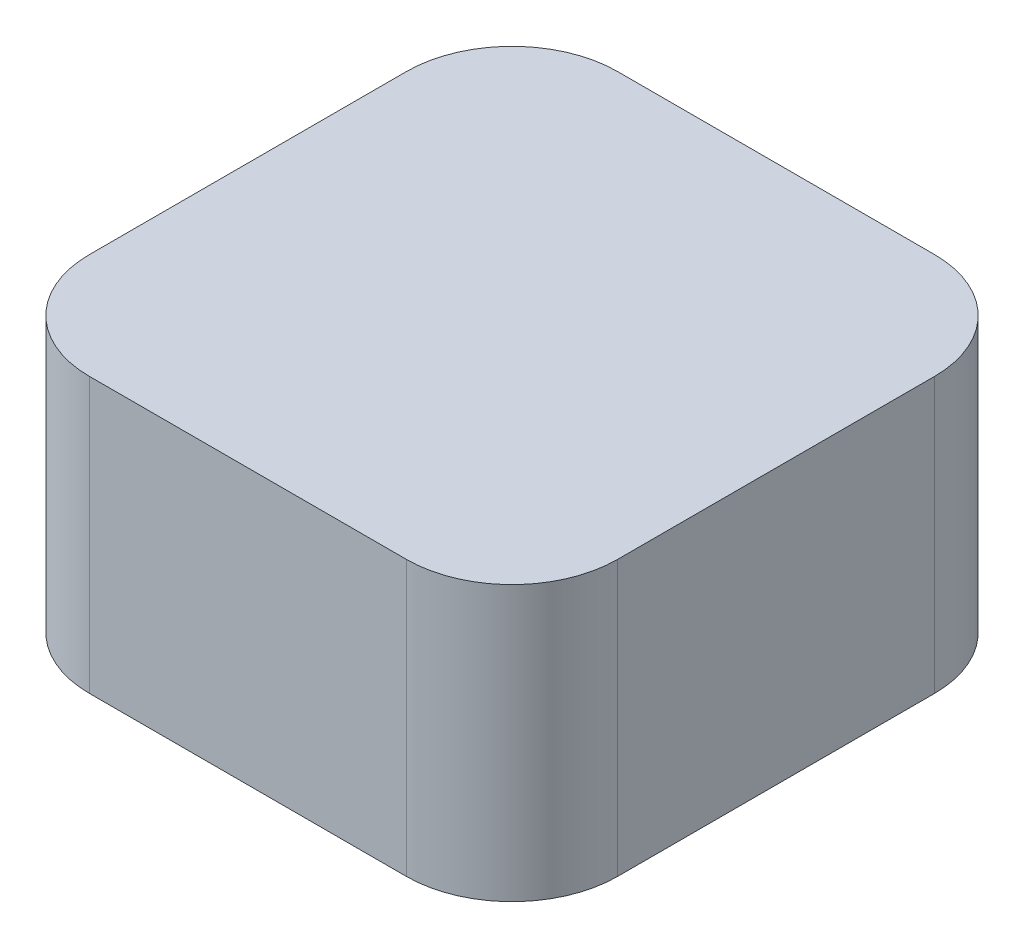
ISO-10303-21;
HEADER;
FILE_DESCRIPTION(('STEP AP214'),'2;1');
FILE_NAME('part.step','',(''),(''),'','','');
FILE_SCHEMA(('AUTOMOTIVE_DESIGN { 1 0 10303 214 1 1 1 1 }'));
ENDSEC;
DATA;
#1=APPLICATION_CONTEXT('core data for automotive mechanical design processes');
#2=APPLICATION_PROTOCOL_DEFINITION('international standard','automotive_design',2000,#1);
#3=PRODUCT_CONTEXT('',#1,'mechanical');
#4=PRODUCT('Part','Part','',(#3));
#5=PRODUCT_RELATED_PRODUCT_CATEGORY('part','',(#4));
#6=PRODUCT_DEFINITION_FORMATION('','',#4);
#7=PRODUCT_DEFINITION_CONTEXT('part definition',#1,'design');
#8=PRODUCT_DEFINITION('design','',#6,#7);
#9=PRODUCT_DEFINITION_SHAPE('','',#8);
#10=(LENGTH_UNIT() NAMED_UNIT(*) SI_UNIT(.MILLI.,.METRE.));
#11=(NAMED_UNIT(*) PLANE_ANGLE_UNIT() SI_UNIT($,.RADIAN.));
#12=(NAMED_UNIT(*) SI_UNIT($,.STERADIAN.) SOLID_ANGLE_UNIT());
#13=UNCERTAINTY_MEASURE_WITH_UNIT(LENGTH_MEASURE(1.E-05),#10,'distance_accuracy_value','');
#14=(GEOMETRIC_REPRESENTATION_CONTEXT(3) GLOBAL_UNCERTAINTY_ASSIGNED_CONTEXT((#13)) GLOBAL_UNIT_ASSIGNED_CONTEXT((#10,
#11,#12)) REPRESENTATION_CONTEXT('',''));
#15=CARTESIAN_POINT('',(0.,0.,0.));
#16=DIRECTION('',(0.,0.,1.));
#17=DIRECTION('',(1.,0.,0.));
#18=AXIS2_PLACEMENT_3D('',#15,#16,#17);
#19=CARTESIAN_POINT('',(0.,6.5,0.));
#20=DIRECTION('',(1.,0.,0.));
#21=DIRECTION('',(0.,0.,-1.));
#22=AXIS2_PLACEMENT_3D('',#19,#20,#21);
#23=PLANE('',#22);
#24=DIRECTION('',(0.,0.,1.));
#25=VECTOR('',#24,1.);
#26=CARTESIAN_POINT('',(0.,6.5,0.));
#27=LINE('',#26,#25);
#28=CARTESIAN_POINT('',(0.,6.5,-10.));
#29=VERTEX_POINT('',#28);
#30=CARTESIAN_POINT('',(0.,6.5,-2.5));
#31=VERTEX_POINT('',#30);
#32=EDGE_CURVE('E125',#29,#31,#27,.T.);
#33=ORIENTED_EDGE('',*,*,#32,.F.);
#34=DIRECTION('',(0.,-1.,0.));
#35=VECTOR('',#34,1.);
#36=CARTESIAN_POINT('',(0.,6.5,-10.));
#37=LINE('',#36,#35);
#38=CARTESIAN_POINT('',(0.,0.,-10.));
#39=VERTEX_POINT('',#38);
#40=EDGE_CURVE('E151',#29,#39,#37,.T.);
#41=ORIENTED_EDGE('',*,*,#40,.T.);
#42=DIRECTION('',(0.,0.,1.));
#43=VECTOR('',#42,1.);
#44=CARTESIAN_POINT('',(0.,0.,0.));
#45=LINE('',#44,#43);
#46=CARTESIAN_POINT('',(0.,0.,-2.5));
#47=VERTEX_POINT('',#46);
#48=EDGE_CURVE('E157',#39,#47,#45,.T.);
#49=ORIENTED_EDGE('',*,*,#48,.T.);
#50=DIRECTION('',(0.,-1.,0.));
#51=VECTOR('',#50,1.);
#52=CARTESIAN_POINT('',(0.,6.5,-2.5));
#53=LINE('',#52,#51);
#54=EDGE_CURVE('E149',#47,#31,#53,.F.);
#55=ORIENTED_EDGE('',*,*,#54,.T.);
#56=EDGE_LOOP('',(#33,#41,#49,#55));
#57=FACE_BOUND('',#56,.T.);
#58=ADVANCED_FACE('F33',(#57),#23,.F.);
#59=CARTESIAN_POINT('',(0.,6.5,0.));
#60=DIRECTION('',(0.,0.,-1.));
#61=DIRECTION('',(-1.,0.,0.));
#62=AXIS2_PLACEMENT_3D('',#59,#60,#61);
#63=PLANE('',#62);
#64=DIRECTION('',(1.,0.,0.));
#65=VECTOR('',#64,1.);
#66=CARTESIAN_POINT('',(0.,6.5,0.));
#67=LINE('',#66,#65);
#68=CARTESIAN_POINT('',(2.5,6.5,0.));
#69=VERTEX_POINT('',#68);
#70=CARTESIAN_POINT('',(9.99999999999999,6.5,0.));
#71=VERTEX_POINT('',#70);
#72=EDGE_CURVE('E128',#69,#71,#67,.T.);
#73=ORIENTED_EDGE('',*,*,#72,.F.);
#74=DIRECTION('',(0.,-1.,0.));
#75=VECTOR('',#74,1.);
#76=CARTESIAN_POINT('',(2.5,6.5,0.));
#77=LINE('',#76,#75);
#78=CARTESIAN_POINT('',(2.5,0.,0.));
#79=VERTEX_POINT('',#78);
#80=EDGE_CURVE('E11',#69,#79,#77,.T.);
#81=ORIENTED_EDGE('',*,*,#80,.T.);
#82=DIRECTION('',(1.,0.,0.));
#83=VECTOR('',#82,1.);
#84=CARTESIAN_POINT('',(0.,0.,0.));
#85=LINE('',#84,#83);
#86=CARTESIAN_POINT('',(9.99999999999999,0.,0.));
#87=VERTEX_POINT('',#86);
#88=EDGE_CURVE('E130',#79,#87,#85,.T.);
#89=ORIENTED_EDGE('',*,*,#88,.T.);
#90=DIRECTION('',(0.,-1.,0.));
#91=VECTOR('',#90,1.);
#92=CARTESIAN_POINT('',(10.,6.5,0.));
#93=LINE('',#92,#91);
#94=EDGE_CURVE('E41',#87,#71,#93,.F.);
#95=ORIENTED_EDGE('',*,*,#94,.T.);
#96=EDGE_LOOP('',(#73,#81,#89,#95));
#97=FACE_BOUND('',#96,.T.);
#98=ADVANCED_FACE('F176',(#97),#63,.F.);
#99=CARTESIAN_POINT('',(12.5,6.5,0.));
#100=DIRECTION('',(-1.,0.,0.));
#101=DIRECTION('',(0.,0.,1.));
#102=AXIS2_PLACEMENT_3D('',#99,#100,#101);
#103=PLANE('',#102);
#104=DIRECTION('',(0.,0.,-1.));
#105=VECTOR('',#104,1.);
#106=CARTESIAN_POINT('',(12.5,0.,0.));
#107=LINE('',#106,#105);
#108=CARTESIAN_POINT('',(12.5,0.,-2.5));
#109=VERTEX_POINT('',#108);
#110=CARTESIAN_POINT('',(12.5,0.,-10.));
#111=VERTEX_POINT('',#110);
#112=EDGE_CURVE('E126',#109,#111,#107,.T.);
#113=ORIENTED_EDGE('',*,*,#112,.T.);
#114=DIRECTION('',(0.,-1.,0.));
#115=VECTOR('',#114,1.);
#116=CARTESIAN_POINT('',(12.5,6.5,-10.));
#117=LINE('',#116,#115);
#118=CARTESIAN_POINT('',(12.5,6.5,-10.));
#119=VERTEX_POINT('',#118);
#120=EDGE_CURVE('E104',#111,#119,#117,.F.);
#121=ORIENTED_EDGE('',*,*,#120,.T.);
#122=DIRECTION('',(0.,0.,-1.));
#123=VECTOR('',#122,1.);
#124=CARTESIAN_POINT('',(12.5,6.5,0.));
#125=LINE('',#124,#123);
#126=CARTESIAN_POINT('',(12.5,6.5,-2.5));
#127=VERTEX_POINT('',#126);
#128=EDGE_CURVE('E165',#127,#119,#125,.T.);
#129=ORIENTED_EDGE('',*,*,#128,.F.);
#130=DIRECTION('',(0.,-1.,0.));
#131=VECTOR('',#130,1.);
#132=CARTESIAN_POINT('',(12.5,6.5,-2.5));
#133=LINE('',#132,#131);
#134=EDGE_CURVE('E109',#127,#109,#133,.T.);
#135=ORIENTED_EDGE('',*,*,#134,.T.);
#136=EDGE_LOOP('',(#113,#121,#129,#135));
#137=FACE_BOUND('',#136,.T.);
#138=ADVANCED_FACE('F175',(#137),#103,.F.);
#139=CARTESIAN_POINT('',(0.,6.5,-12.5));
#140=DIRECTION('',(0.,0.,1.));
#141=DIRECTION('',(1.,0.,0.));
#142=AXIS2_PLACEMENT_3D('',#139,#140,#141);
#143=PLANE('',#142);
#144=DIRECTION('',(-1.,0.,0.));
#145=VECTOR('',#144,1.);
#146=CARTESIAN_POINT('',(0.,6.5,-12.5));
#147=LINE('',#146,#145);
#148=CARTESIAN_POINT('',(9.99999999999999,6.5,-12.5));
#149=VERTEX_POINT('',#148);
#150=CARTESIAN_POINT('',(2.5,6.5,-12.5));
#151=VERTEX_POINT('',#150);
#152=EDGE_CURVE('E119',#149,#151,#147,.T.);
#153=ORIENTED_EDGE('',*,*,#152,.F.);
#154=DIRECTION('',(0.,-1.,0.));
#155=VECTOR('',#154,1.);
#156=CARTESIAN_POINT('',(10.,6.5,-12.5));
#157=LINE('',#156,#155);
#158=CARTESIAN_POINT('',(9.99999999999999,0.,-12.5));
#159=VERTEX_POINT('',#158);
#160=EDGE_CURVE('E103',#149,#159,#157,.T.);
#161=ORIENTED_EDGE('',*,*,#160,.T.);
#162=DIRECTION('',(-1.,0.,0.));
#163=VECTOR('',#162,1.);
#164=CARTESIAN_POINT('',(0.,0.,-12.5));
#165=LINE('',#164,#163);
#166=CARTESIAN_POINT('',(2.5,0.,-12.5));
#167=VERTEX_POINT('',#166);
#168=EDGE_CURVE('E116',#159,#167,#165,.T.);
#169=ORIENTED_EDGE('',*,*,#168,.T.);
#170=DIRECTION('',(0.,-1.,0.));
#171=VECTOR('',#170,1.);
#172=CARTESIAN_POINT('',(2.5,6.5,-12.5));
#173=LINE('',#172,#171);
#174=EDGE_CURVE('E121',#167,#151,#173,.F.);
#175=ORIENTED_EDGE('',*,*,#174,.T.);
#176=EDGE_LOOP('',(#153,#161,#169,#175));
#177=FACE_BOUND('',#176,.T.);
#178=ADVANCED_FACE('F115',(#177),#143,.F.);
#179=CARTESIAN_POINT('',(0.,6.5,0.));
#180=DIRECTION('',(0.,-1.,0.));
#181=DIRECTION('',(0.,0.,-1.));
#182=AXIS2_PLACEMENT_3D('',#179,#180,#181);
#183=PLANE('',#182);
#184=ORIENTED_EDGE('',*,*,#128,.T.);
#185=CARTESIAN_POINT('',(10.,6.5,-10.));
#186=DIRECTION('',(0.,-1.,0.));
#187=DIRECTION('',(0.,0.,-1.));
#188=AXIS2_PLACEMENT_3D('',#185,#186,#187);
#189=CIRCLE('',#188,2.5);
#190=EDGE_CURVE('E147',#119,#149,#189,.F.);
#191=ORIENTED_EDGE('',*,*,#190,.T.);
#192=ORIENTED_EDGE('',*,*,#152,.T.);
#193=CARTESIAN_POINT('',(2.5,6.5,-10.));
#194=DIRECTION('',(0.,-1.,0.));
#195=DIRECTION('',(0.,0.,-1.));
#196=AXIS2_PLACEMENT_3D('',#193,#194,#195);
#197=CIRCLE('',#196,2.5);
#198=EDGE_CURVE('E145',#151,#29,#197,.F.);
#199=ORIENTED_EDGE('',*,*,#198,.T.);
#200=ORIENTED_EDGE('',*,*,#32,.T.);
#201=CARTESIAN_POINT('',(2.5,6.5,-2.5));
#202=DIRECTION('',(0.,-1.,0.));
#203=DIRECTION('',(0.,0.,-1.));
#204=AXIS2_PLACEMENT_3D('',#201,#202,#203);
#205=CIRCLE('',#204,2.5);
#206=EDGE_CURVE('E54',#31,#69,#205,.F.);
#207=ORIENTED_EDGE('',*,*,#206,.T.);
#208=ORIENTED_EDGE('',*,*,#72,.T.);
#209=CARTESIAN_POINT('',(10.,6.5,-2.5));
#210=DIRECTION('',(0.,-1.,0.));
#211=DIRECTION('',(0.,0.,-1.));
#212=AXIS2_PLACEMENT_3D('',#209,#210,#211);
#213=CIRCLE('',#212,2.5);
#214=EDGE_CURVE('E142',#71,#127,#213,.F.);
#215=ORIENTED_EDGE('',*,*,#214,.T.);
#216=EDGE_LOOP('',(#184,#191,#192,#199,#200,#207,#208,#215));
#217=FACE_BOUND('',#216,.T.);
#218=ADVANCED_FACE('F169',(#217),#183,.F.);
#219=CARTESIAN_POINT('',(0.,0.,0.));
#220=DIRECTION('',(0.,-1.,0.));
#221=DIRECTION('',(0.,0.,-1.));
#222=AXIS2_PLACEMENT_3D('',#219,#220,#221);
#223=PLANE('',#222);
#224=ORIENTED_EDGE('',*,*,#168,.F.);
#225=CARTESIAN_POINT('',(10.,0.,-10.));
#226=DIRECTION('',(0.,-1.,0.));
#227=DIRECTION('',(0.,0.,-1.));
#228=AXIS2_PLACEMENT_3D('',#225,#226,#227);
#229=CIRCLE('',#228,2.5);
#230=EDGE_CURVE('E99',#159,#111,#229,.T.);
#231=ORIENTED_EDGE('',*,*,#230,.T.);
#232=ORIENTED_EDGE('',*,*,#112,.F.);
#233=CARTESIAN_POINT('',(10.,0.,-2.5));
#234=DIRECTION('',(0.,-1.,0.));
#235=DIRECTION('',(0.,0.,-1.));
#236=AXIS2_PLACEMENT_3D('',#233,#234,#235);
#237=CIRCLE('',#236,2.5);
#238=EDGE_CURVE('E120',#109,#87,#237,.T.);
#239=ORIENTED_EDGE('',*,*,#238,.T.);
#240=ORIENTED_EDGE('',*,*,#88,.F.);
#241=CARTESIAN_POINT('',(2.5,0.,-2.5));
#242=DIRECTION('',(0.,-1.,0.));
#243=DIRECTION('',(0.,0.,-1.));
#244=AXIS2_PLACEMENT_3D('',#241,#242,#243);
#245=CIRCLE('',#244,2.5);
#246=EDGE_CURVE('E136',#79,#47,#245,.T.);
#247=ORIENTED_EDGE('',*,*,#246,.T.);
#248=ORIENTED_EDGE('',*,*,#48,.F.);
#249=CARTESIAN_POINT('',(2.5,0.,-10.));
#250=DIRECTION('',(0.,-1.,0.));
#251=DIRECTION('',(0.,0.,-1.));
#252=AXIS2_PLACEMENT_3D('',#249,#250,#251);
#253=CIRCLE('',#252,2.5);
#254=EDGE_CURVE('E110',#39,#167,#253,.T.);
#255=ORIENTED_EDGE('',*,*,#254,.T.);
#256=EDGE_LOOP('',(#224,#231,#232,#239,#240,#247,#248,#255));
#257=FACE_BOUND('',#256,.T.);
#258=ADVANCED_FACE('F123',(#257),#223,.T.);
#259=CARTESIAN_POINT('',(10.,6.5,-10.));
#260=DIRECTION('',(0.,-1.,0.));
#261=DIRECTION('',(0.,0.,-1.));
#262=AXIS2_PLACEMENT_3D('',#259,#260,#261);
#263=CYLINDRICAL_SURFACE('',#262,2.5);
#264=ORIENTED_EDGE('',*,*,#190,.F.);
#265=ORIENTED_EDGE('',*,*,#120,.F.);
#266=ORIENTED_EDGE('',*,*,#230,.F.);
#267=ORIENTED_EDGE('',*,*,#160,.F.);
#268=EDGE_LOOP('',(#264,#265,#266,#267));
#269=FACE_BOUND('',#268,.T.);
#270=ADVANCED_FACE('F102',(#269),#263,.T.);
#271=CARTESIAN_POINT('',(2.5,6.5,-10.));
#272=DIRECTION('',(0.,-1.,0.));
#273=DIRECTION('',(0.,0.,-1.));
#274=AXIS2_PLACEMENT_3D('',#271,#272,#273);
#275=CYLINDRICAL_SURFACE('',#274,2.5);
#276=ORIENTED_EDGE('',*,*,#198,.F.);
#277=ORIENTED_EDGE('',*,*,#174,.F.);
#278=ORIENTED_EDGE('',*,*,#254,.F.);
#279=ORIENTED_EDGE('',*,*,#40,.F.);
#280=EDGE_LOOP('',(#276,#277,#278,#279));
#281=FACE_BOUND('',#280,.T.);
#282=ADVANCED_FACE('F179',(#281),#275,.T.);
#283=CARTESIAN_POINT('',(2.5,6.5,-2.5));
#284=DIRECTION('',(0.,-1.,0.));
#285=DIRECTION('',(0.,0.,-1.));
#286=AXIS2_PLACEMENT_3D('',#283,#284,#285);
#287=CYLINDRICAL_SURFACE('',#286,2.5);
#288=ORIENTED_EDGE('',*,*,#206,.F.);
#289=ORIENTED_EDGE('',*,*,#54,.F.);
#290=ORIENTED_EDGE('',*,*,#246,.F.);
#291=ORIENTED_EDGE('',*,*,#80,.F.);
#292=EDGE_LOOP('',(#288,#289,#290,#291));
#293=FACE_BOUND('',#292,.T.);
#294=ADVANCED_FACE('F178',(#293),#287,.T.);
#295=CARTESIAN_POINT('',(10.,6.5,-2.5));
#296=DIRECTION('',(0.,-1.,0.));
#297=DIRECTION('',(0.,0.,-1.));
#298=AXIS2_PLACEMENT_3D('',#295,#296,#297);
#299=CYLINDRICAL_SURFACE('',#298,2.5);
#300=ORIENTED_EDGE('',*,*,#214,.F.);
#301=ORIENTED_EDGE('',*,*,#94,.F.);
#302=ORIENTED_EDGE('',*,*,#238,.F.);
#303=ORIENTED_EDGE('',*,*,#134,.F.);
#304=EDGE_LOOP('',(#300,#301,#302,#303));
#305=FACE_BOUND('',#304,.T.);
#306=ADVANCED_FACE('F35',(#305),#299,.T.);
#307=CLOSED_SHELL('',(#58,#98,#138,#178,#218,#258,#270,#282,#294,#306));
#308=MANIFOLD_SOLID_BREP('B2',#307);
#309=ADVANCED_BREP_SHAPE_REPRESENTATION('',(#18,#308),#14);
#310=SHAPE_DEFINITION_REPRESENTATION(#9,#309);
ENDSEC;
END-ISO-10303-21;
